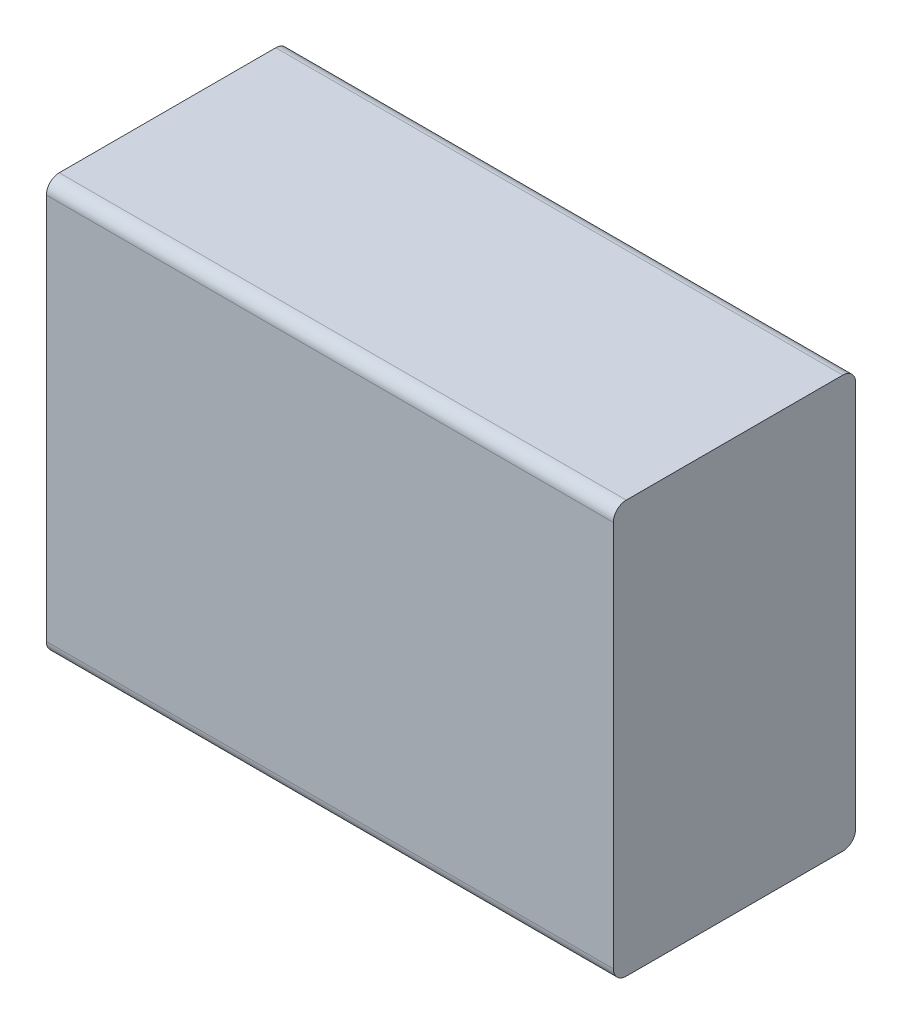
ISO-10303-21;
HEADER;
FILE_DESCRIPTION(('STEP AP214'),'2;1');
FILE_NAME('part.step','',(''),(''),'','','');
FILE_SCHEMA(('AUTOMOTIVE_DESIGN { 1 0 10303 214 1 1 1 1 }'));
ENDSEC;
DATA;
#1=APPLICATION_CONTEXT('core data for automotive mechanical design processes');
#2=APPLICATION_PROTOCOL_DEFINITION('international standard','automotive_design',2000,#1);
#3=PRODUCT_CONTEXT('',#1,'mechanical');
#4=PRODUCT('Part','Part','',(#3));
#5=PRODUCT_RELATED_PRODUCT_CATEGORY('part','',(#4));
#6=PRODUCT_DEFINITION_FORMATION('','',#4);
#7=PRODUCT_DEFINITION_CONTEXT('part definition',#1,'design');
#8=PRODUCT_DEFINITION('design','',#6,#7);
#9=PRODUCT_DEFINITION_SHAPE('','',#8);
#10=(LENGTH_UNIT() NAMED_UNIT(*) SI_UNIT(.MILLI.,.METRE.));
#11=(NAMED_UNIT(*) PLANE_ANGLE_UNIT() SI_UNIT($,.RADIAN.));
#12=(NAMED_UNIT(*) SI_UNIT($,.STERADIAN.) SOLID_ANGLE_UNIT());
#13=UNCERTAINTY_MEASURE_WITH_UNIT(LENGTH_MEASURE(1.E-05),#10,'distance_accuracy_value','');
#14=(GEOMETRIC_REPRESENTATION_CONTEXT(3) GLOBAL_UNCERTAINTY_ASSIGNED_CONTEXT((#13)) GLOBAL_UNIT_ASSIGNED_CONTEXT((#10,
#11,#12)) REPRESENTATION_CONTEXT('',''));
#15=CARTESIAN_POINT('',(0.,0.,0.));
#16=DIRECTION('',(0.,0.,1.));
#17=DIRECTION('',(1.,0.,0.));
#18=AXIS2_PLACEMENT_3D('',#15,#16,#17);
#19=CARTESIAN_POINT('',(0.549999999999999,0.750000000000001,0.89));
#20=DIRECTION('',(-1.,0.,0.));
#21=DIRECTION('',(0.,0.707106781186548,0.707106781186548));
#22=AXIS2_PLACEMENT_3D('',#19,#20,#21);
#23=CYLINDRICAL_SURFACE('',#22,0.05);
#24=CARTESIAN_POINT('',(-1.1,0.75,0.89));
#25=DIRECTION('',(1.,0.,0.));
#26=DIRECTION('',(0.,0.707106781186548,0.707106781186548));
#27=AXIS2_PLACEMENT_3D('',#24,#25,#26);
#28=CIRCLE('',#27,0.05);
#29=CARTESIAN_POINT('',(-1.1,0.8,0.89));
#30=VERTEX_POINT('',#29);
#31=CARTESIAN_POINT('',(-1.1,0.75,0.94));
#32=VERTEX_POINT('',#31);
#33=EDGE_CURVE('E11',#30,#32,#28,.T.);
#34=ORIENTED_EDGE('',*,*,#33,.T.);
#35=DIRECTION('',(1.,0.,0.));
#36=VECTOR('',#35,1.);
#37=CARTESIAN_POINT('',(0.549999999999999,0.750000000000001,0.94));
#38=LINE('',#37,#36);
#39=CARTESIAN_POINT('',(1.1,0.750000000000001,0.94));
#40=VERTEX_POINT('',#39);
#41=EDGE_CURVE('E24',#32,#40,#38,.T.);
#42=ORIENTED_EDGE('',*,*,#41,.T.);
#43=CARTESIAN_POINT('',(1.1,0.750000000000001,0.89));
#44=DIRECTION('',(-1.,0.,0.));
#45=DIRECTION('',(0.,0.707106781186548,0.707106781186548));
#46=AXIS2_PLACEMENT_3D('',#43,#44,#45);
#47=CIRCLE('',#46,0.05);
#48=CARTESIAN_POINT('',(1.1,0.800000000000001,0.89));
#49=VERTEX_POINT('',#48);
#50=EDGE_CURVE('E84',#40,#49,#47,.T.);
#51=ORIENTED_EDGE('',*,*,#50,.T.);
#52=DIRECTION('',(-1.,0.,0.));
#53=VECTOR('',#52,1.);
#54=CARTESIAN_POINT('',(0.549999999999999,0.800000000000001,0.89));
#55=LINE('',#54,#53);
#56=EDGE_CURVE('E142',#49,#30,#55,.T.);
#57=ORIENTED_EDGE('',*,*,#56,.T.);
#58=EDGE_LOOP('',(#34,#42,#51,#57));
#59=FACE_BOUND('',#58,.T.);
#60=ADVANCED_FACE('F17',(#59),#23,.T.);
#61=CARTESIAN_POINT('',(-1.1,0.8,0.));
#62=DIRECTION('',(-1.,0.,0.));
#63=DIRECTION('',(0.,-1.,0.));
#64=AXIS2_PLACEMENT_3D('',#61,#62,#63);
#65=PLANE('',#64);
#66=ORIENTED_EDGE('',*,*,#33,.F.);
#67=DIRECTION('',(0.,0.,1.));
#68=VECTOR('',#67,1.);
#69=CARTESIAN_POINT('',(-1.1,0.8,0.));
#70=LINE('',#69,#68);
#71=CARTESIAN_POINT('',(-1.1,0.8,0.05));
#72=VERTEX_POINT('',#71);
#73=EDGE_CURVE('E139',#72,#30,#70,.T.);
#74=ORIENTED_EDGE('',*,*,#73,.F.);
#75=CARTESIAN_POINT('',(-1.1,0.75,0.05));
#76=DIRECTION('',(1.,0.,0.));
#77=DIRECTION('',(0.,0.707106781186548,-0.707106781186547));
#78=AXIS2_PLACEMENT_3D('',#75,#76,#77);
#79=CIRCLE('',#78,0.05);
#80=CARTESIAN_POINT('',(-1.1,0.75,0.));
#81=VERTEX_POINT('',#80);
#82=EDGE_CURVE('E136',#81,#72,#79,.T.);
#83=ORIENTED_EDGE('',*,*,#82,.F.);
#84=DIRECTION('',(0.,-1.,0.));
#85=VECTOR('',#84,1.);
#86=CARTESIAN_POINT('',(-1.1,0.8,0.));
#87=LINE('',#86,#85);
#88=CARTESIAN_POINT('',(-1.1,-0.75,0.));
#89=VERTEX_POINT('',#88);
#90=EDGE_CURVE('E134',#81,#89,#87,.T.);
#91=ORIENTED_EDGE('',*,*,#90,.T.);
#92=CARTESIAN_POINT('',(-1.1,-0.75,0.05));
#93=DIRECTION('',(1.,0.,0.));
#94=DIRECTION('',(0.,-0.707106781186548,-0.707106781186547));
#95=AXIS2_PLACEMENT_3D('',#92,#93,#94);
#96=CIRCLE('',#95,0.05);
#97=CARTESIAN_POINT('',(-1.1,-0.8,0.05));
#98=VERTEX_POINT('',#97);
#99=EDGE_CURVE('E131',#98,#89,#96,.T.);
#100=ORIENTED_EDGE('',*,*,#99,.F.);
#101=DIRECTION('',(0.,0.,1.));
#102=VECTOR('',#101,1.);
#103=CARTESIAN_POINT('',(-1.1,-0.8,0.));
#104=LINE('',#103,#102);
#105=CARTESIAN_POINT('',(-1.1,-0.8,0.89));
#106=VERTEX_POINT('',#105);
#107=EDGE_CURVE('E129',#98,#106,#104,.T.);
#108=ORIENTED_EDGE('',*,*,#107,.T.);
#109=CARTESIAN_POINT('',(-1.1,-0.75,0.89));
#110=DIRECTION('',(1.,0.,0.));
#111=DIRECTION('',(0.,-0.707106781186548,0.707106781186548));
#112=AXIS2_PLACEMENT_3D('',#109,#110,#111);
#113=CIRCLE('',#112,0.05);
#114=CARTESIAN_POINT('',(-1.1,-0.75,0.94));
#115=VERTEX_POINT('',#114);
#116=EDGE_CURVE('E127',#115,#106,#113,.T.);
#117=ORIENTED_EDGE('',*,*,#116,.F.);
#118=DIRECTION('',(0.,-1.,0.));
#119=VECTOR('',#118,1.);
#120=CARTESIAN_POINT('',(-1.1,0.8,0.94));
#121=LINE('',#120,#119);
#122=EDGE_CURVE('E100',#32,#115,#121,.T.);
#123=ORIENTED_EDGE('',*,*,#122,.F.);
#124=EDGE_LOOP('',(#66,#74,#83,#91,#100,#108,#117,#123));
#125=FACE_BOUND('',#124,.T.);
#126=ADVANCED_FACE('F145',(#125),#65,.T.);
#127=CARTESIAN_POINT('',(1.1,0.800000000000001,0.));
#128=DIRECTION('',(0.,1.,0.));
#129=DIRECTION('',(-1.,0.,0.));
#130=AXIS2_PLACEMENT_3D('',#127,#128,#129);
#131=PLANE('',#130);
#132=ORIENTED_EDGE('',*,*,#56,.F.);
#133=DIRECTION('',(0.,0.,1.));
#134=VECTOR('',#133,1.);
#135=CARTESIAN_POINT('',(1.1,0.800000000000001,0.));
#136=LINE('',#135,#134);
#137=CARTESIAN_POINT('',(1.1,0.800000000000001,0.05));
#138=VERTEX_POINT('',#137);
#139=EDGE_CURVE('E124',#138,#49,#136,.T.);
#140=ORIENTED_EDGE('',*,*,#139,.F.);
#141=DIRECTION('',(1.,0.,0.));
#142=VECTOR('',#141,1.);
#143=CARTESIAN_POINT('',(0.549999999999999,0.800000000000001,0.05));
#144=LINE('',#143,#142);
#145=EDGE_CURVE('E121',#72,#138,#144,.T.);
#146=ORIENTED_EDGE('',*,*,#145,.F.);
#147=ORIENTED_EDGE('',*,*,#73,.T.);
#148=EDGE_LOOP('',(#132,#140,#146,#147));
#149=FACE_BOUND('',#148,.T.);
#150=ADVANCED_FACE('F163',(#149),#131,.T.);
#151=CARTESIAN_POINT('',(0.549999999999999,0.750000000000001,0.05));
#152=DIRECTION('',(-1.,0.,0.));
#153=DIRECTION('',(0.,0.707106781186548,-0.707106781186547));
#154=AXIS2_PLACEMENT_3D('',#151,#152,#153);
#155=CYLINDRICAL_SURFACE('',#154,0.05);
#156=ORIENTED_EDGE('',*,*,#82,.T.);
#157=ORIENTED_EDGE('',*,*,#145,.T.);
#158=CARTESIAN_POINT('',(1.1,0.750000000000001,0.05));
#159=DIRECTION('',(-1.,0.,0.));
#160=DIRECTION('',(0.,0.707106781186548,-0.707106781186547));
#161=AXIS2_PLACEMENT_3D('',#158,#159,#160);
#162=CIRCLE('',#161,0.05);
#163=CARTESIAN_POINT('',(1.1,0.750000000000001,0.));
#164=VERTEX_POINT('',#163);
#165=EDGE_CURVE('E119',#138,#164,#162,.T.);
#166=ORIENTED_EDGE('',*,*,#165,.T.);
#167=DIRECTION('',(-1.,0.,0.));
#168=VECTOR('',#167,1.);
#169=CARTESIAN_POINT('',(0.549999999999999,0.750000000000001,0.));
#170=LINE('',#169,#168);
#171=EDGE_CURVE('E116',#164,#81,#170,.T.);
#172=ORIENTED_EDGE('',*,*,#171,.T.);
#173=EDGE_LOOP('',(#156,#157,#166,#172));
#174=FACE_BOUND('',#173,.T.);
#175=ADVANCED_FACE('F160',(#174),#155,.T.);
#176=CARTESIAN_POINT('',(-0.550000000000001,-0.75,0.05));
#177=DIRECTION('',(1.,0.,0.));
#178=DIRECTION('',(0.,-0.707106781186548,-0.707106781186547));
#179=AXIS2_PLACEMENT_3D('',#176,#177,#178);
#180=CYLINDRICAL_SURFACE('',#179,0.05);
#181=CARTESIAN_POINT('',(1.1,-0.749999999999999,0.05));
#182=DIRECTION('',(-1.,0.,0.));
#183=DIRECTION('',(0.,-0.707106781186548,-0.707106781186547));
#184=AXIS2_PLACEMENT_3D('',#181,#182,#183);
#185=CIRCLE('',#184,0.05);
#186=CARTESIAN_POINT('',(1.1,-0.749999999999999,0.));
#187=VERTEX_POINT('',#186);
#188=CARTESIAN_POINT('',(1.1,-0.799999999999999,0.05));
#189=VERTEX_POINT('',#188);
#190=EDGE_CURVE('E114',#187,#189,#185,.T.);
#191=ORIENTED_EDGE('',*,*,#190,.T.);
#192=DIRECTION('',(-1.,0.,0.));
#193=VECTOR('',#192,1.);
#194=CARTESIAN_POINT('',(-0.550000000000001,-0.8,0.05));
#195=LINE('',#194,#193);
#196=EDGE_CURVE('E111',#189,#98,#195,.T.);
#197=ORIENTED_EDGE('',*,*,#196,.T.);
#198=ORIENTED_EDGE('',*,*,#99,.T.);
#199=DIRECTION('',(1.,0.,0.));
#200=VECTOR('',#199,1.);
#201=CARTESIAN_POINT('',(-0.550000000000001,-0.75,0.));
#202=LINE('',#201,#200);
#203=EDGE_CURVE('E108',#89,#187,#202,.T.);
#204=ORIENTED_EDGE('',*,*,#203,.T.);
#205=EDGE_LOOP('',(#191,#197,#198,#204));
#206=FACE_BOUND('',#205,.T.);
#207=ADVANCED_FACE('F154',(#206),#180,.T.);
#208=CARTESIAN_POINT('',(-1.1,-0.8,0.));
#209=DIRECTION('',(0.,-1.,0.));
#210=DIRECTION('',(1.,0.,0.));
#211=AXIS2_PLACEMENT_3D('',#208,#209,#210);
#212=PLANE('',#211);
#213=ORIENTED_EDGE('',*,*,#196,.F.);
#214=DIRECTION('',(0.,0.,1.));
#215=VECTOR('',#214,1.);
#216=CARTESIAN_POINT('',(1.1,-0.799999999999999,0.));
#217=LINE('',#216,#215);
#218=CARTESIAN_POINT('',(1.1,-0.799999999999999,0.89));
#219=VERTEX_POINT('',#218);
#220=EDGE_CURVE('E106',#189,#219,#217,.T.);
#221=ORIENTED_EDGE('',*,*,#220,.T.);
#222=DIRECTION('',(1.,0.,0.));
#223=VECTOR('',#222,1.);
#224=CARTESIAN_POINT('',(-0.550000000000001,-0.8,0.89));
#225=LINE('',#224,#223);
#226=EDGE_CURVE('E87',#106,#219,#225,.T.);
#227=ORIENTED_EDGE('',*,*,#226,.F.);
#228=ORIENTED_EDGE('',*,*,#107,.F.);
#229=EDGE_LOOP('',(#213,#221,#227,#228));
#230=FACE_BOUND('',#229,.T.);
#231=ADVANCED_FACE('F149',(#230),#212,.T.);
#232=CARTESIAN_POINT('',(1.1,-0.799999999999999,0.));
#233=DIRECTION('',(1.,0.,0.));
#234=DIRECTION('',(0.,1.,0.));
#235=AXIS2_PLACEMENT_3D('',#232,#233,#234);
#236=PLANE('',#235);
#237=ORIENTED_EDGE('',*,*,#50,.F.);
#238=DIRECTION('',(0.,1.,0.));
#239=VECTOR('',#238,1.);
#240=CARTESIAN_POINT('',(1.1,-0.799999999999999,0.94));
#241=LINE('',#240,#239);
#242=CARTESIAN_POINT('',(1.1,-0.749999999999999,0.94));
#243=VERTEX_POINT('',#242);
#244=EDGE_CURVE('E78',#243,#40,#241,.T.);
#245=ORIENTED_EDGE('',*,*,#244,.F.);
#246=CARTESIAN_POINT('',(1.1,-0.749999999999999,0.89));
#247=DIRECTION('',(-1.,0.,0.));
#248=DIRECTION('',(0.,-0.707106781186548,0.707106781186548));
#249=AXIS2_PLACEMENT_3D('',#246,#247,#248);
#250=CIRCLE('',#249,0.05);
#251=EDGE_CURVE('E82',#219,#243,#250,.T.);
#252=ORIENTED_EDGE('',*,*,#251,.F.);
#253=ORIENTED_EDGE('',*,*,#220,.F.);
#254=ORIENTED_EDGE('',*,*,#190,.F.);
#255=DIRECTION('',(0.,1.,0.));
#256=VECTOR('',#255,1.);
#257=CARTESIAN_POINT('',(1.1,-0.799999999999999,0.));
#258=LINE('',#257,#256);
#259=EDGE_CURVE('E96',#187,#164,#258,.T.);
#260=ORIENTED_EDGE('',*,*,#259,.T.);
#261=ORIENTED_EDGE('',*,*,#165,.F.);
#262=ORIENTED_EDGE('',*,*,#139,.T.);
#263=EDGE_LOOP('',(#237,#245,#252,#253,#254,#260,#261,#262));
#264=FACE_BOUND('',#263,.T.);
#265=ADVANCED_FACE('F80',(#264),#236,.T.);
#266=CARTESIAN_POINT('',(-0.550000000000001,-0.75,0.89));
#267=DIRECTION('',(1.,0.,0.));
#268=DIRECTION('',(0.,-0.707106781186548,0.707106781186548));
#269=AXIS2_PLACEMENT_3D('',#266,#267,#268);
#270=CYLINDRICAL_SURFACE('',#269,0.05);
#271=ORIENTED_EDGE('',*,*,#251,.T.);
#272=DIRECTION('',(-1.,0.,0.));
#273=VECTOR('',#272,1.);
#274=CARTESIAN_POINT('',(-0.550000000000001,-0.75,0.94));
#275=LINE('',#274,#273);
#276=EDGE_CURVE('E94',#243,#115,#275,.T.);
#277=ORIENTED_EDGE('',*,*,#276,.T.);
#278=ORIENTED_EDGE('',*,*,#116,.T.);
#279=ORIENTED_EDGE('',*,*,#226,.T.);
#280=EDGE_LOOP('',(#271,#277,#278,#279));
#281=FACE_BOUND('',#280,.T.);
#282=ADVANCED_FACE('F92',(#281),#270,.T.);
#283=CARTESIAN_POINT('',(0.,0.,0.94));
#284=DIRECTION('',(0.,0.,1.));
#285=DIRECTION('',(1.,0.,0.));
#286=AXIS2_PLACEMENT_3D('',#283,#284,#285);
#287=PLANE('',#286);
#288=ORIENTED_EDGE('',*,*,#41,.F.);
#289=ORIENTED_EDGE('',*,*,#122,.T.);
#290=ORIENTED_EDGE('',*,*,#276,.F.);
#291=ORIENTED_EDGE('',*,*,#244,.T.);
#292=EDGE_LOOP('',(#288,#289,#290,#291));
#293=FACE_BOUND('',#292,.T.);
#294=ADVANCED_FACE('F99',(#293),#287,.T.);
#295=CARTESIAN_POINT('',(0.,0.,0.));
#296=DIRECTION('',(0.,0.,1.));
#297=DIRECTION('',(1.,0.,0.));
#298=AXIS2_PLACEMENT_3D('',#295,#296,#297);
#299=PLANE('',#298);
#300=ORIENTED_EDGE('',*,*,#171,.F.);
#301=ORIENTED_EDGE('',*,*,#259,.F.);
#302=ORIENTED_EDGE('',*,*,#203,.F.);
#303=ORIENTED_EDGE('',*,*,#90,.F.);
#304=EDGE_LOOP('',(#300,#301,#302,#303));
#305=FACE_BOUND('',#304,.T.);
#306=ADVANCED_FACE('F158',(#305),#299,.F.);
#307=CLOSED_SHELL('',(#60,#126,#150,#175,#207,#231,#265,#282,#294,#306));
#308=MANIFOLD_SOLID_BREP('B1',#307);
#309=ADVANCED_BREP_SHAPE_REPRESENTATION('',(#18,#308),#14);
#310=SHAPE_DEFINITION_REPRESENTATION(#9,#309);
ENDSEC;
END-ISO-10303-21;
